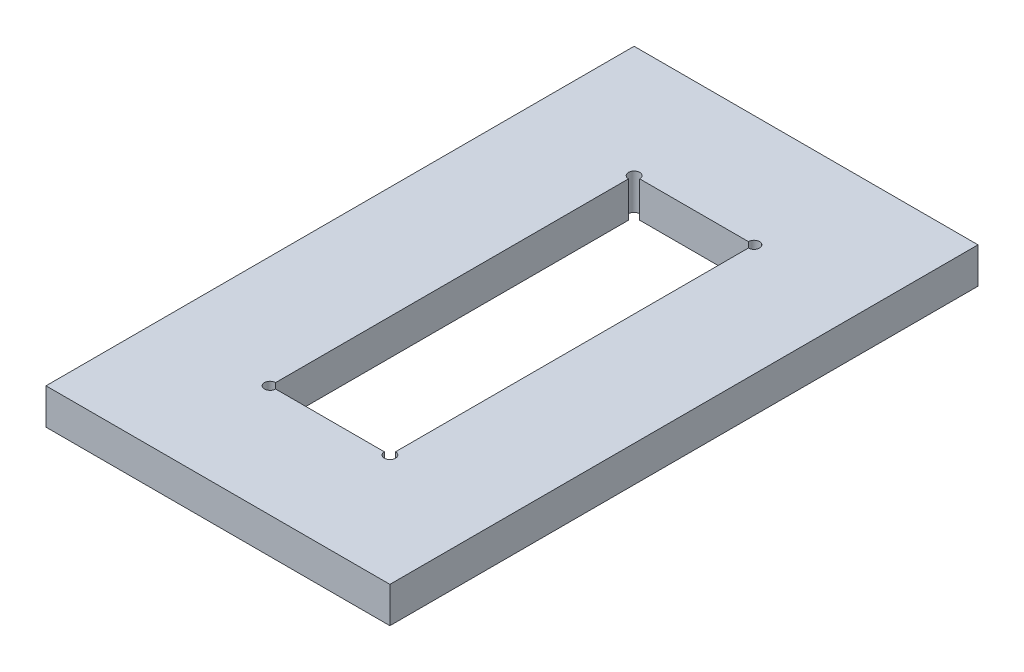
ISO-10303-21;
HEADER;
FILE_DESCRIPTION(('STEP AP214'),'2;1');
FILE_NAME('part.step','',(''),(''),'','','');
FILE_SCHEMA(('AUTOMOTIVE_DESIGN { 1 0 10303 214 1 1 1 1 }'));
ENDSEC;
DATA;
#1=APPLICATION_CONTEXT('core data for automotive mechanical design processes');
#2=APPLICATION_PROTOCOL_DEFINITION('international standard','automotive_design',2000,#1);
#3=PRODUCT_CONTEXT('',#1,'mechanical');
#4=PRODUCT('Part','Part','',(#3));
#5=PRODUCT_RELATED_PRODUCT_CATEGORY('part','',(#4));
#6=PRODUCT_DEFINITION_FORMATION('','',#4);
#7=PRODUCT_DEFINITION_CONTEXT('part definition',#1,'design');
#8=PRODUCT_DEFINITION('design','',#6,#7);
#9=PRODUCT_DEFINITION_SHAPE('','',#8);
#10=(LENGTH_UNIT() NAMED_UNIT(*) SI_UNIT(.MILLI.,.METRE.));
#11=(NAMED_UNIT(*) PLANE_ANGLE_UNIT() SI_UNIT($,.RADIAN.));
#12=(NAMED_UNIT(*) SI_UNIT($,.STERADIAN.) SOLID_ANGLE_UNIT());
#13=UNCERTAINTY_MEASURE_WITH_UNIT(LENGTH_MEASURE(1.E-05),#10,'distance_accuracy_value','');
#14=(GEOMETRIC_REPRESENTATION_CONTEXT(3) GLOBAL_UNCERTAINTY_ASSIGNED_CONTEXT((#13)) GLOBAL_UNIT_ASSIGNED_CONTEXT((#10,
#11,#12)) REPRESENTATION_CONTEXT('',''));
#15=CARTESIAN_POINT('',(0.,0.,0.));
#16=DIRECTION('',(0.,0.,1.));
#17=DIRECTION('',(1.,0.,0.));
#18=AXIS2_PLACEMENT_3D('',#15,#16,#17);
#19=CARTESIAN_POINT('',(0.,3.2,0.));
#20=DIRECTION('',(0.,1.,0.));
#21=DIRECTION('',(0.,0.,1.));
#22=AXIS2_PLACEMENT_3D('',#19,#20,#21);
#23=PLANE('',#22);
#24=DIRECTION('',(1.,0.,0.));
#25=VECTOR('',#24,1.);
#26=CARTESIAN_POINT('',(-10.,3.2,10.));
#27=LINE('',#26,#25);
#28=CARTESIAN_POINT('',(-10.,3.2,10.));
#29=VERTEX_POINT('',#28);
#30=CARTESIAN_POINT('',(20.7,3.2,10.));
#31=VERTEX_POINT('',#30);
#32=EDGE_CURVE('E196',#29,#31,#27,.T.);
#33=ORIENTED_EDGE('',*,*,#32,.T.);
#34=DIRECTION('',(0.,0.,-1.));
#35=VECTOR('',#34,1.);
#36=CARTESIAN_POINT('',(20.7,3.2,10.));
#37=LINE('',#36,#35);
#38=CARTESIAN_POINT('',(20.7,3.2,-42.5));
#39=VERTEX_POINT('',#38);
#40=EDGE_CURVE('E199',#31,#39,#37,.T.);
#41=ORIENTED_EDGE('',*,*,#40,.T.);
#42=DIRECTION('',(-1.,0.,0.));
#43=VECTOR('',#42,1.);
#44=CARTESIAN_POINT('',(-10.,3.2,-42.5));
#45=LINE('',#44,#43);
#46=CARTESIAN_POINT('',(-10.,3.2,-42.5));
#47=VERTEX_POINT('',#46);
#48=EDGE_CURVE('E202',#39,#47,#45,.T.);
#49=ORIENTED_EDGE('',*,*,#48,.T.);
#50=DIRECTION('',(0.,0.,1.));
#51=VECTOR('',#50,1.);
#52=CARTESIAN_POINT('',(-10.,3.2,10.));
#53=LINE('',#52,#51);
#54=EDGE_CURVE('E204',#47,#29,#53,.T.);
#55=ORIENTED_EDGE('',*,*,#54,.T.);
#56=EDGE_LOOP('',(#33,#41,#49,#55));
#57=FACE_BOUND('',#56,.T.);
#58=DIRECTION('',(0.,0.,1.));
#59=VECTOR('',#58,1.);
#60=CARTESIAN_POINT('',(0.,3.2,-0.5));
#61=LINE('',#60,#59);
#62=CARTESIAN_POINT('',(0.,3.2,-32.));
#63=VERTEX_POINT('',#62);
#64=CARTESIAN_POINT('',(0.,3.2,-0.5));
#65=VERTEX_POINT('',#64);
#66=EDGE_CURVE('E139',#63,#65,#61,.T.);
#67=ORIENTED_EDGE('',*,*,#66,.F.);
#68=CARTESIAN_POINT('',(0.,3.2,-32.5));
#69=DIRECTION('',(0.,1.,0.));
#70=DIRECTION('',(0.,0.,1.));
#71=AXIS2_PLACEMENT_3D('',#68,#69,#70);
#72=CIRCLE('',#71,0.5);
#73=CARTESIAN_POINT('',(0.5,3.2,-32.5));
#74=VERTEX_POINT('',#73);
#75=EDGE_CURVE('E131',#74,#63,#72,.T.);
#76=ORIENTED_EDGE('',*,*,#75,.F.);
#77=DIRECTION('',(-1.,0.,0.));
#78=VECTOR('',#77,1.);
#79=CARTESIAN_POINT('',(0.5,3.2,-32.5));
#80=LINE('',#79,#78);
#81=CARTESIAN_POINT('',(10.2,3.2,-32.5));
#82=VERTEX_POINT('',#81);
#83=EDGE_CURVE('E164',#82,#74,#80,.T.);
#84=ORIENTED_EDGE('',*,*,#83,.F.);
#85=CARTESIAN_POINT('',(10.7,3.2,-32.5));
#86=DIRECTION('',(0.,1.,0.));
#87=DIRECTION('',(0.,0.,1.));
#88=AXIS2_PLACEMENT_3D('',#85,#86,#87);
#89=CIRCLE('',#88,0.5);
#90=CARTESIAN_POINT('',(10.7,3.2,-32.));
#91=VERTEX_POINT('',#90);
#92=EDGE_CURVE('E162',#91,#82,#89,.T.);
#93=ORIENTED_EDGE('',*,*,#92,.F.);
#94=DIRECTION('',(0.,0.,-1.));
#95=VECTOR('',#94,1.);
#96=CARTESIAN_POINT('',(10.7,3.2,-0.500000000000001));
#97=LINE('',#96,#95);
#98=CARTESIAN_POINT('',(10.7,3.2,-0.500000000000001));
#99=VERTEX_POINT('',#98);
#100=EDGE_CURVE('E160',#99,#91,#97,.T.);
#101=ORIENTED_EDGE('',*,*,#100,.F.);
#102=CARTESIAN_POINT('',(10.7,3.2,0.));
#103=DIRECTION('',(0.,1.,0.));
#104=DIRECTION('',(0.,0.,1.));
#105=AXIS2_PLACEMENT_3D('',#102,#103,#104);
#106=CIRCLE('',#105,0.500000000000001);
#107=CARTESIAN_POINT('',(10.2,3.2,0.));
#108=VERTEX_POINT('',#107);
#109=EDGE_CURVE('E158',#108,#99,#106,.T.);
#110=ORIENTED_EDGE('',*,*,#109,.F.);
#111=DIRECTION('',(1.,0.,0.));
#112=VECTOR('',#111,1.);
#113=CARTESIAN_POINT('',(0.5,3.2,0.));
#114=LINE('',#113,#112);
#115=CARTESIAN_POINT('',(0.5,3.2,0.));
#116=VERTEX_POINT('',#115);
#117=EDGE_CURVE('E154',#116,#108,#114,.T.);
#118=ORIENTED_EDGE('',*,*,#117,.F.);
#119=CARTESIAN_POINT('',(0.,3.2,0.));
#120=DIRECTION('',(0.,1.,0.));
#121=DIRECTION('',(0.,0.,1.));
#122=AXIS2_PLACEMENT_3D('',#119,#120,#121);
#123=CIRCLE('',#122,0.5);
#124=EDGE_CURVE('E152',#65,#116,#123,.T.);
#125=ORIENTED_EDGE('',*,*,#124,.F.);
#126=EDGE_LOOP('',(#67,#76,#84,#93,#101,#110,#118,#125));
#127=FACE_BOUND('',#126,.T.);
#128=ADVANCED_FACE('F42',(#57,#127),#23,.T.);
#129=CARTESIAN_POINT('',(0.,0.,0.));
#130=DIRECTION('',(0.,1.,0.));
#131=DIRECTION('',(0.,0.,1.));
#132=AXIS2_PLACEMENT_3D('',#129,#130,#131);
#133=PLANE('',#132);
#134=DIRECTION('',(1.,0.,0.));
#135=VECTOR('',#134,1.);
#136=CARTESIAN_POINT('',(-10.,0.,10.));
#137=LINE('',#136,#135);
#138=CARTESIAN_POINT('',(-10.,0.,10.));
#139=VERTEX_POINT('',#138);
#140=CARTESIAN_POINT('',(20.7,0.,10.));
#141=VERTEX_POINT('',#140);
#142=EDGE_CURVE('E147',#139,#141,#137,.T.);
#143=ORIENTED_EDGE('',*,*,#142,.F.);
#144=DIRECTION('',(0.,0.,1.));
#145=VECTOR('',#144,1.);
#146=CARTESIAN_POINT('',(-10.,0.,10.));
#147=LINE('',#146,#145);
#148=CARTESIAN_POINT('',(-10.,0.,-42.5));
#149=VERTEX_POINT('',#148);
#150=EDGE_CURVE('E200',#149,#139,#147,.T.);
#151=ORIENTED_EDGE('',*,*,#150,.F.);
#152=DIRECTION('',(-1.,0.,0.));
#153=VECTOR('',#152,1.);
#154=CARTESIAN_POINT('',(-10.,0.,-42.5));
#155=LINE('',#154,#153);
#156=CARTESIAN_POINT('',(20.7,0.,-42.5));
#157=VERTEX_POINT('',#156);
#158=EDGE_CURVE('E211',#157,#149,#155,.T.);
#159=ORIENTED_EDGE('',*,*,#158,.F.);
#160=DIRECTION('',(0.,0.,-1.));
#161=VECTOR('',#160,1.);
#162=CARTESIAN_POINT('',(20.7,0.,10.));
#163=LINE('',#162,#161);
#164=EDGE_CURVE('E209',#141,#157,#163,.T.);
#165=ORIENTED_EDGE('',*,*,#164,.F.);
#166=EDGE_LOOP('',(#143,#151,#159,#165));
#167=FACE_BOUND('',#166,.T.);
#168=CARTESIAN_POINT('',(0.,0.,-32.5));
#169=DIRECTION('',(0.,1.,0.));
#170=DIRECTION('',(0.,0.,1.));
#171=AXIS2_PLACEMENT_3D('',#168,#169,#170);
#172=CIRCLE('',#171,0.5);
#173=CARTESIAN_POINT('',(0.5,0.,-32.5));
#174=VERTEX_POINT('',#173);
#175=CARTESIAN_POINT('',(0.,0.,-32.));
#176=VERTEX_POINT('',#175);
#177=EDGE_CURVE('E65',#174,#176,#172,.T.);
#178=ORIENTED_EDGE('',*,*,#177,.T.);
#179=DIRECTION('',(0.,0.,1.));
#180=VECTOR('',#179,1.);
#181=CARTESIAN_POINT('',(0.,0.,-0.5));
#182=LINE('',#181,#180);
#183=CARTESIAN_POINT('',(0.,0.,-0.5));
#184=VERTEX_POINT('',#183);
#185=EDGE_CURVE('E146',#176,#184,#182,.T.);
#186=ORIENTED_EDGE('',*,*,#185,.T.);
#187=CARTESIAN_POINT('',(0.,0.,0.));
#188=DIRECTION('',(0.,1.,0.));
#189=DIRECTION('',(0.,0.,1.));
#190=AXIS2_PLACEMENT_3D('',#187,#188,#189);
#191=CIRCLE('',#190,0.5);
#192=CARTESIAN_POINT('',(0.5,0.,0.));
#193=VERTEX_POINT('',#192);
#194=EDGE_CURVE('E168',#184,#193,#191,.T.);
#195=ORIENTED_EDGE('',*,*,#194,.T.);
#196=DIRECTION('',(1.,0.,0.));
#197=VECTOR('',#196,1.);
#198=CARTESIAN_POINT('',(0.5,0.,0.));
#199=LINE('',#198,#197);
#200=CARTESIAN_POINT('',(10.2,0.,0.));
#201=VERTEX_POINT('',#200);
#202=EDGE_CURVE('E171',#193,#201,#199,.T.);
#203=ORIENTED_EDGE('',*,*,#202,.T.);
#204=CARTESIAN_POINT('',(10.7,0.,0.));
#205=DIRECTION('',(0.,1.,0.));
#206=DIRECTION('',(0.,0.,1.));
#207=AXIS2_PLACEMENT_3D('',#204,#205,#206);
#208=CIRCLE('',#207,0.500000000000001);
#209=CARTESIAN_POINT('',(10.7,0.,-0.500000000000001));
#210=VERTEX_POINT('',#209);
#211=EDGE_CURVE('E174',#201,#210,#208,.T.);
#212=ORIENTED_EDGE('',*,*,#211,.T.);
#213=DIRECTION('',(0.,0.,-1.));
#214=VECTOR('',#213,1.);
#215=CARTESIAN_POINT('',(10.7,0.,-0.500000000000001));
#216=LINE('',#215,#214);
#217=CARTESIAN_POINT('',(10.7,0.,-32.));
#218=VERTEX_POINT('',#217);
#219=EDGE_CURVE('E177',#210,#218,#216,.T.);
#220=ORIENTED_EDGE('',*,*,#219,.T.);
#221=CARTESIAN_POINT('',(10.7,0.,-32.5));
#222=DIRECTION('',(0.,1.,0.));
#223=DIRECTION('',(0.,0.,1.));
#224=AXIS2_PLACEMENT_3D('',#221,#222,#223);
#225=CIRCLE('',#224,0.5);
#226=CARTESIAN_POINT('',(10.2,0.,-32.5));
#227=VERTEX_POINT('',#226);
#228=EDGE_CURVE('E180',#218,#227,#225,.T.);
#229=ORIENTED_EDGE('',*,*,#228,.T.);
#230=DIRECTION('',(-1.,0.,0.));
#231=VECTOR('',#230,1.);
#232=CARTESIAN_POINT('',(0.5,0.,-32.5));
#233=LINE('',#232,#231);
#234=EDGE_CURVE('E140',#227,#174,#233,.T.);
#235=ORIENTED_EDGE('',*,*,#234,.T.);
#236=EDGE_LOOP('',(#178,#186,#195,#203,#212,#220,#229,#235));
#237=FACE_BOUND('',#236,.T.);
#238=ADVANCED_FACE('F229',(#167,#237),#133,.F.);
#239=CARTESIAN_POINT('',(-10.,3.2,10.));
#240=DIRECTION('',(0.,0.,-1.));
#241=DIRECTION('',(-1.,0.,0.));
#242=AXIS2_PLACEMENT_3D('',#239,#240,#241);
#243=PLANE('',#242);
#244=ORIENTED_EDGE('',*,*,#142,.T.);
#245=DIRECTION('',(0.,-1.,0.));
#246=VECTOR('',#245,1.);
#247=CARTESIAN_POINT('',(20.7,3.2,10.));
#248=LINE('',#247,#246);
#249=EDGE_CURVE('E11',#31,#141,#248,.T.);
#250=ORIENTED_EDGE('',*,*,#249,.F.);
#251=ORIENTED_EDGE('',*,*,#32,.F.);
#252=DIRECTION('',(0.,-1.,0.));
#253=VECTOR('',#252,1.);
#254=CARTESIAN_POINT('',(-10.,3.2,10.));
#255=LINE('',#254,#253);
#256=EDGE_CURVE('E206',#29,#139,#255,.T.);
#257=ORIENTED_EDGE('',*,*,#256,.T.);
#258=EDGE_LOOP('',(#244,#250,#251,#257));
#259=FACE_BOUND('',#258,.T.);
#260=ADVANCED_FACE('F44',(#259),#243,.F.);
#261=CARTESIAN_POINT('',(20.7,3.2,10.));
#262=DIRECTION('',(-1.,0.,0.));
#263=DIRECTION('',(0.,0.,1.));
#264=AXIS2_PLACEMENT_3D('',#261,#262,#263);
#265=PLANE('',#264);
#266=ORIENTED_EDGE('',*,*,#164,.T.);
#267=DIRECTION('',(0.,-1.,0.));
#268=VECTOR('',#267,1.);
#269=CARTESIAN_POINT('',(20.7,3.2,-42.5));
#270=LINE('',#269,#268);
#271=EDGE_CURVE('E50',#39,#157,#270,.T.);
#272=ORIENTED_EDGE('',*,*,#271,.F.);
#273=ORIENTED_EDGE('',*,*,#40,.F.);
#274=ORIENTED_EDGE('',*,*,#249,.T.);
#275=EDGE_LOOP('',(#266,#272,#273,#274));
#276=FACE_BOUND('',#275,.T.);
#277=ADVANCED_FACE('F239',(#276),#265,.F.);
#278=CARTESIAN_POINT('',(-10.,3.2,-42.5));
#279=DIRECTION('',(0.,0.,1.));
#280=DIRECTION('',(1.,0.,0.));
#281=AXIS2_PLACEMENT_3D('',#278,#279,#280);
#282=PLANE('',#281);
#283=ORIENTED_EDGE('',*,*,#158,.T.);
#284=DIRECTION('',(0.,-1.,0.));
#285=VECTOR('',#284,1.);
#286=CARTESIAN_POINT('',(-10.,3.2,-42.5));
#287=LINE('',#286,#285);
#288=EDGE_CURVE('E216',#47,#149,#287,.T.);
#289=ORIENTED_EDGE('',*,*,#288,.F.);
#290=ORIENTED_EDGE('',*,*,#48,.F.);
#291=ORIENTED_EDGE('',*,*,#271,.T.);
#292=EDGE_LOOP('',(#283,#289,#290,#291));
#293=FACE_BOUND('',#292,.T.);
#294=ADVANCED_FACE('F223',(#293),#282,.F.);
#295=CARTESIAN_POINT('',(-10.,3.2,10.));
#296=DIRECTION('',(1.,0.,0.));
#297=DIRECTION('',(0.,0.,-1.));
#298=AXIS2_PLACEMENT_3D('',#295,#296,#297);
#299=PLANE('',#298);
#300=ORIENTED_EDGE('',*,*,#150,.T.);
#301=ORIENTED_EDGE('',*,*,#256,.F.);
#302=ORIENTED_EDGE('',*,*,#54,.F.);
#303=ORIENTED_EDGE('',*,*,#288,.T.);
#304=EDGE_LOOP('',(#300,#301,#302,#303));
#305=FACE_BOUND('',#304,.T.);
#306=ADVANCED_FACE('F233',(#305),#299,.F.);
#307=CARTESIAN_POINT('',(0.,3.2,-32.5));
#308=DIRECTION('',(0.,-1.,0.));
#309=DIRECTION('',(0.,0.,-1.));
#310=AXIS2_PLACEMENT_3D('',#307,#308,#309);
#311=CYLINDRICAL_SURFACE('',#310,0.5);
#312=ORIENTED_EDGE('',*,*,#177,.F.);
#313=DIRECTION('',(0.,-1.,0.));
#314=VECTOR('',#313,1.);
#315=CARTESIAN_POINT('',(0.5,3.2,-32.5));
#316=LINE('',#315,#314);
#317=EDGE_CURVE('E135',#74,#174,#316,.T.);
#318=ORIENTED_EDGE('',*,*,#317,.F.);
#319=ORIENTED_EDGE('',*,*,#75,.T.);
#320=DIRECTION('',(0.,-1.,0.));
#321=VECTOR('',#320,1.);
#322=CARTESIAN_POINT('',(0.,3.2,-32.));
#323=LINE('',#322,#321);
#324=EDGE_CURVE('E134',#63,#176,#323,.T.);
#325=ORIENTED_EDGE('',*,*,#324,.T.);
#326=EDGE_LOOP('',(#312,#318,#319,#325));
#327=FACE_BOUND('',#326,.T.);
#328=ADVANCED_FACE('F133',(#327),#311,.F.);
#329=CARTESIAN_POINT('',(0.,3.2,-0.5));
#330=DIRECTION('',(1.,0.,0.));
#331=DIRECTION('',(0.,0.,-1.));
#332=AXIS2_PLACEMENT_3D('',#329,#330,#331);
#333=PLANE('',#332);
#334=ORIENTED_EDGE('',*,*,#185,.F.);
#335=ORIENTED_EDGE('',*,*,#324,.F.);
#336=ORIENTED_EDGE('',*,*,#66,.T.);
#337=DIRECTION('',(0.,-1.,0.));
#338=VECTOR('',#337,1.);
#339=CARTESIAN_POINT('',(0.,3.2,-0.5));
#340=LINE('',#339,#338);
#341=EDGE_CURVE('E148',#65,#184,#340,.T.);
#342=ORIENTED_EDGE('',*,*,#341,.T.);
#343=EDGE_LOOP('',(#334,#335,#336,#342));
#344=FACE_BOUND('',#343,.T.);
#345=ADVANCED_FACE('F143',(#344),#333,.T.);
#346=CARTESIAN_POINT('',(0.,3.2,0.));
#347=DIRECTION('',(0.,-1.,0.));
#348=DIRECTION('',(0.,0.,-1.));
#349=AXIS2_PLACEMENT_3D('',#346,#347,#348);
#350=CYLINDRICAL_SURFACE('',#349,0.5);
#351=ORIENTED_EDGE('',*,*,#194,.F.);
#352=ORIENTED_EDGE('',*,*,#341,.F.);
#353=ORIENTED_EDGE('',*,*,#124,.T.);
#354=DIRECTION('',(0.,-1.,0.));
#355=VECTOR('',#354,1.);
#356=CARTESIAN_POINT('',(0.5,3.2,0.));
#357=LINE('',#356,#355);
#358=EDGE_CURVE('E193',#116,#193,#357,.T.);
#359=ORIENTED_EDGE('',*,*,#358,.T.);
#360=EDGE_LOOP('',(#351,#352,#353,#359));
#361=FACE_BOUND('',#360,.T.);
#362=ADVANCED_FACE('F262',(#361),#350,.F.);
#363=CARTESIAN_POINT('',(0.5,3.2,0.));
#364=DIRECTION('',(0.,0.,-1.));
#365=DIRECTION('',(-1.,0.,0.));
#366=AXIS2_PLACEMENT_3D('',#363,#364,#365);
#367=PLANE('',#366);
#368=ORIENTED_EDGE('',*,*,#202,.F.);
#369=ORIENTED_EDGE('',*,*,#358,.F.);
#370=ORIENTED_EDGE('',*,*,#117,.T.);
#371=DIRECTION('',(0.,-1.,0.));
#372=VECTOR('',#371,1.);
#373=CARTESIAN_POINT('',(10.2,3.2,0.));
#374=LINE('',#373,#372);
#375=EDGE_CURVE('E191',#108,#201,#374,.T.);
#376=ORIENTED_EDGE('',*,*,#375,.T.);
#377=EDGE_LOOP('',(#368,#369,#370,#376));
#378=FACE_BOUND('',#377,.T.);
#379=ADVANCED_FACE('F266',(#378),#367,.T.);
#380=CARTESIAN_POINT('',(10.7,3.2,0.));
#381=DIRECTION('',(0.,-1.,0.));
#382=DIRECTION('',(0.,0.,-1.));
#383=AXIS2_PLACEMENT_3D('',#380,#381,#382);
#384=CYLINDRICAL_SURFACE('',#383,0.500000000000001);
#385=ORIENTED_EDGE('',*,*,#211,.F.);
#386=ORIENTED_EDGE('',*,*,#375,.F.);
#387=ORIENTED_EDGE('',*,*,#109,.T.);
#388=DIRECTION('',(0.,-1.,0.));
#389=VECTOR('',#388,1.);
#390=CARTESIAN_POINT('',(10.7,3.2,-0.500000000000001));
#391=LINE('',#390,#389);
#392=EDGE_CURVE('E189',#99,#210,#391,.T.);
#393=ORIENTED_EDGE('',*,*,#392,.T.);
#394=EDGE_LOOP('',(#385,#386,#387,#393));
#395=FACE_BOUND('',#394,.T.);
#396=ADVANCED_FACE('F272',(#395),#384,.F.);
#397=CARTESIAN_POINT('',(10.7,3.2,-0.500000000000001));
#398=DIRECTION('',(-1.,0.,0.));
#399=DIRECTION('',(0.,0.,1.));
#400=AXIS2_PLACEMENT_3D('',#397,#398,#399);
#401=PLANE('',#400);
#402=ORIENTED_EDGE('',*,*,#219,.F.);
#403=ORIENTED_EDGE('',*,*,#392,.F.);
#404=ORIENTED_EDGE('',*,*,#100,.T.);
#405=DIRECTION('',(0.,-1.,0.));
#406=VECTOR('',#405,1.);
#407=CARTESIAN_POINT('',(10.7,3.2,-32.));
#408=LINE('',#407,#406);
#409=EDGE_CURVE('E187',#91,#218,#408,.T.);
#410=ORIENTED_EDGE('',*,*,#409,.T.);
#411=EDGE_LOOP('',(#402,#403,#404,#410));
#412=FACE_BOUND('',#411,.T.);
#413=ADVANCED_FACE('F276',(#412),#401,.T.);
#414=CARTESIAN_POINT('',(10.7,3.2,-32.5));
#415=DIRECTION('',(0.,-1.,0.));
#416=DIRECTION('',(0.,0.,-1.));
#417=AXIS2_PLACEMENT_3D('',#414,#415,#416);
#418=CYLINDRICAL_SURFACE('',#417,0.5);
#419=ORIENTED_EDGE('',*,*,#228,.F.);
#420=ORIENTED_EDGE('',*,*,#409,.F.);
#421=ORIENTED_EDGE('',*,*,#92,.T.);
#422=DIRECTION('',(0.,-1.,0.));
#423=VECTOR('',#422,1.);
#424=CARTESIAN_POINT('',(10.2,3.2,-32.5));
#425=LINE('',#424,#423);
#426=EDGE_CURVE('E57',#82,#227,#425,.T.);
#427=ORIENTED_EDGE('',*,*,#426,.T.);
#428=EDGE_LOOP('',(#419,#420,#421,#427));
#429=FACE_BOUND('',#428,.T.);
#430=ADVANCED_FACE('F280',(#429),#418,.F.);
#431=CARTESIAN_POINT('',(0.5,3.2,-32.5));
#432=DIRECTION('',(0.,0.,1.));
#433=DIRECTION('',(1.,0.,0.));
#434=AXIS2_PLACEMENT_3D('',#431,#432,#433);
#435=PLANE('',#434);
#436=ORIENTED_EDGE('',*,*,#234,.F.);
#437=ORIENTED_EDGE('',*,*,#426,.F.);
#438=ORIENTED_EDGE('',*,*,#83,.T.);
#439=ORIENTED_EDGE('',*,*,#317,.T.);
#440=EDGE_LOOP('',(#436,#437,#438,#439));
#441=FACE_BOUND('',#440,.T.);
#442=ADVANCED_FACE('F284',(#441),#435,.T.);
#443=CLOSED_SHELL('',(#128,#238,#260,#277,#294,#306,#328,#345,#362,#379,#396,#413,#430,#442));
#444=MANIFOLD_SOLID_BREP('B2',#443);
#445=ADVANCED_BREP_SHAPE_REPRESENTATION('',(#18,#444),#14);
#446=SHAPE_DEFINITION_REPRESENTATION(#9,#445);
ENDSEC;
END-ISO-10303-21;
